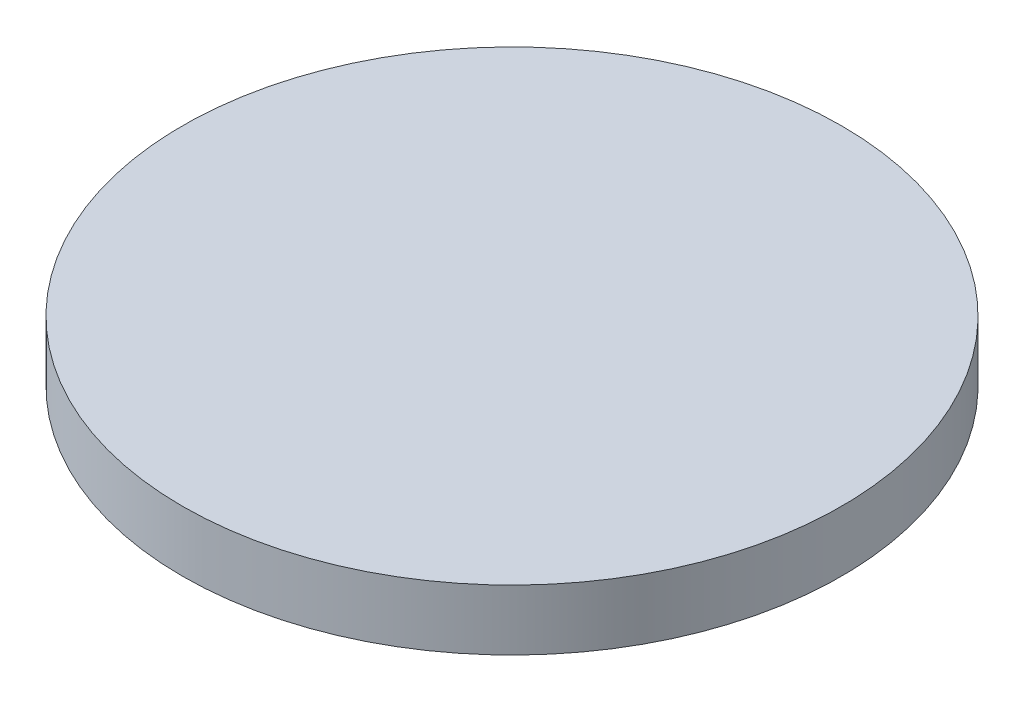
ISO-10303-21;
HEADER;
FILE_DESCRIPTION(('STEP AP214'),'2;1');
FILE_NAME('part.step','',(''),(''),'','','');
FILE_SCHEMA(('AUTOMOTIVE_DESIGN { 1 0 10303 214 1 1 1 1 }'));
ENDSEC;
DATA;
#1=APPLICATION_CONTEXT('core data for automotive mechanical design processes');
#2=APPLICATION_PROTOCOL_DEFINITION('international standard','automotive_design',2000,#1);
#3=PRODUCT_CONTEXT('',#1,'mechanical');
#4=PRODUCT('Part','Part','',(#3));
#5=PRODUCT_RELATED_PRODUCT_CATEGORY('part','',(#4));
#6=PRODUCT_DEFINITION_FORMATION('','',#4);
#7=PRODUCT_DEFINITION_CONTEXT('part definition',#1,'design');
#8=PRODUCT_DEFINITION('design','',#6,#7);
#9=PRODUCT_DEFINITION_SHAPE('','',#8);
#10=(LENGTH_UNIT() NAMED_UNIT(*) SI_UNIT(.MILLI.,.METRE.));
#11=(NAMED_UNIT(*) PLANE_ANGLE_UNIT() SI_UNIT($,.RADIAN.));
#12=(NAMED_UNIT(*) SI_UNIT($,.STERADIAN.) SOLID_ANGLE_UNIT());
#13=UNCERTAINTY_MEASURE_WITH_UNIT(LENGTH_MEASURE(1.E-05),#10,'distance_accuracy_value','');
#14=(GEOMETRIC_REPRESENTATION_CONTEXT(3) GLOBAL_UNCERTAINTY_ASSIGNED_CONTEXT((#13)) GLOBAL_UNIT_ASSIGNED_CONTEXT((#10,
#11,#12)) REPRESENTATION_CONTEXT('',''));
#15=CARTESIAN_POINT('',(0.,0.,0.));
#16=DIRECTION('',(0.,0.,1.));
#17=DIRECTION('',(1.,0.,0.));
#18=AXIS2_PLACEMENT_3D('',#15,#16,#17);
#19=CARTESIAN_POINT('',(0.,1.95,0.));
#20=DIRECTION('',(0.,-1.,0.));
#21=DIRECTION('',(0.,0.,-1.));
#22=AXIS2_PLACEMENT_3D('',#19,#20,#21);
#23=CYLINDRICAL_SURFACE('',#22,10.6045);
#24=CARTESIAN_POINT('',(0.,1.95,0.));
#25=DIRECTION('',(0.,1.,0.));
#26=DIRECTION('',(0.,0.,1.));
#27=AXIS2_PLACEMENT_3D('',#24,#25,#26);
#28=CIRCLE('',#27,10.6045);
#29=CARTESIAN_POINT('',(0.,1.95,10.6045));
#30=VERTEX_POINT('',#29);
#31=EDGE_CURVE('E10',#30,#30,#28,.T.);
#32=ORIENTED_EDGE('',*,*,#31,.F.);
#33=EDGE_LOOP('',(#32));
#34=FACE_BOUND('',#33,.T.);
#35=CARTESIAN_POINT('',(0.,0.,0.));
#36=DIRECTION('',(0.,1.,0.));
#37=DIRECTION('',(0.,0.,1.));
#38=AXIS2_PLACEMENT_3D('',#35,#36,#37);
#39=CIRCLE('',#38,10.6045);
#40=CARTESIAN_POINT('',(0.,0.,10.6045));
#41=VERTEX_POINT('',#40);
#42=EDGE_CURVE('E44',#41,#41,#39,.T.);
#43=ORIENTED_EDGE('',*,*,#42,.T.);
#44=EDGE_LOOP('',(#43));
#45=FACE_BOUND('',#44,.T.);
#46=ADVANCED_FACE('F41',(#34,#45),#23,.T.);
#47=CARTESIAN_POINT('',(0.,1.95,0.));
#48=DIRECTION('',(0.,1.,0.));
#49=DIRECTION('',(0.,0.,1.));
#50=AXIS2_PLACEMENT_3D('',#47,#48,#49);
#51=PLANE('',#50);
#52=ORIENTED_EDGE('',*,*,#31,.T.);
#53=EDGE_LOOP('',(#52));
#54=FACE_BOUND('',#53,.T.);
#55=ADVANCED_FACE('F58',(#54),#51,.T.);
#56=CARTESIAN_POINT('',(0.,0.,0.));
#57=DIRECTION('',(0.,1.,0.));
#58=DIRECTION('',(0.,0.,1.));
#59=AXIS2_PLACEMENT_3D('',#56,#57,#58);
#60=PLANE('',#59);
#61=ORIENTED_EDGE('',*,*,#42,.F.);
#62=EDGE_LOOP('',(#61));
#63=FACE_BOUND('',#62,.T.);
#64=ADVANCED_FACE('F56',(#63),#60,.F.);
#65=CLOSED_SHELL('',(#46,#55,#64));
#66=MANIFOLD_SOLID_BREP('B2',#65);
#67=ADVANCED_BREP_SHAPE_REPRESENTATION('',(#18,#66),#14);
#68=SHAPE_DEFINITION_REPRESENTATION(#9,#67);
ENDSEC;
END-ISO-10303-21;
